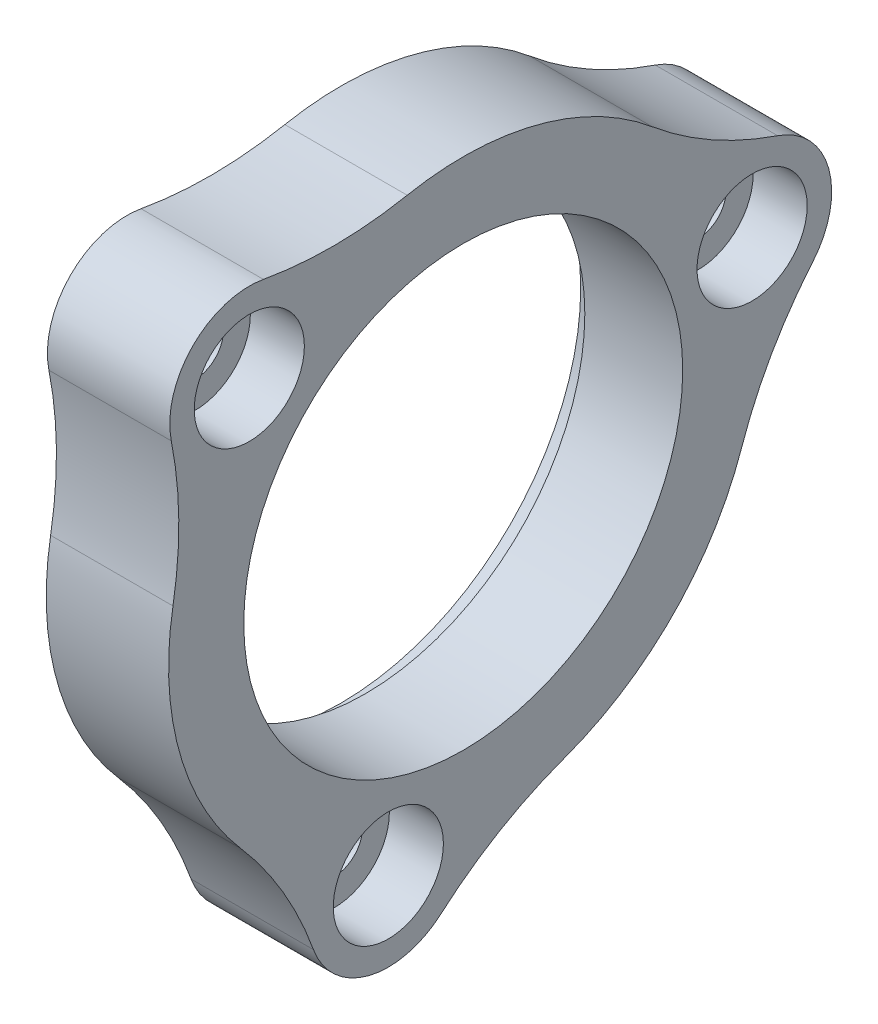
ISO-10303-21;
HEADER;
FILE_DESCRIPTION(('STEP AP214'),'2;1');
FILE_NAME('part.step','',(''),(''),'','','');
FILE_SCHEMA(('AUTOMOTIVE_DESIGN { 1 0 10303 214 1 1 1 1 }'));
ENDSEC;
DATA;
#1=APPLICATION_CONTEXT('core data for automotive mechanical design processes');
#2=APPLICATION_PROTOCOL_DEFINITION('international standard','automotive_design',2000,#1);
#3=PRODUCT_CONTEXT('',#1,'mechanical');
#4=PRODUCT('Part','Part','',(#3));
#5=PRODUCT_RELATED_PRODUCT_CATEGORY('part','',(#4));
#6=PRODUCT_DEFINITION_FORMATION('','',#4);
#7=PRODUCT_DEFINITION_CONTEXT('part definition',#1,'design');
#8=PRODUCT_DEFINITION('design','',#6,#7);
#9=PRODUCT_DEFINITION_SHAPE('','',#8);
#10=(LENGTH_UNIT() NAMED_UNIT(*) SI_UNIT(.MILLI.,.METRE.));
#11=(NAMED_UNIT(*) PLANE_ANGLE_UNIT() SI_UNIT($,.RADIAN.));
#12=(NAMED_UNIT(*) SI_UNIT($,.STERADIAN.) SOLID_ANGLE_UNIT());
#13=UNCERTAINTY_MEASURE_WITH_UNIT(LENGTH_MEASURE(1.E-05),#10,'distance_accuracy_value','');
#14=(GEOMETRIC_REPRESENTATION_CONTEXT(3) GLOBAL_UNCERTAINTY_ASSIGNED_CONTEXT((#13)) GLOBAL_UNIT_ASSIGNED_CONTEXT((#10,
#11,#12)) REPRESENTATION_CONTEXT('',''));
#15=CARTESIAN_POINT('',(0.,0.,0.));
#16=DIRECTION('',(0.,0.,1.));
#17=DIRECTION('',(1.,0.,0.));
#18=AXIS2_PLACEMENT_3D('',#15,#16,#17);
#19=CARTESIAN_POINT('',(55.5625,36.576,-137.31419272294));
#20=DIRECTION('',(-1.,0.,0.));
#21=DIRECTION('',(0.,0.,1.));
#22=AXIS2_PLACEMENT_3D('',#19,#20,#21);
#23=CYLINDRICAL_SURFACE('',#22,14.2367);
#24=CARTESIAN_POINT('',(55.5625,36.576,-137.31419272294));
#25=DIRECTION('',(1.,0.,0.));
#26=DIRECTION('',(0.,0.,-1.));
#27=AXIS2_PLACEMENT_3D('',#24,#25,#26);
#28=CIRCLE('',#27,14.2367);
#29=CARTESIAN_POINT('',(55.5625,36.576,-151.55089272294));
#30=VERTEX_POINT('',#29);
#31=EDGE_CURVE('E157',#30,#30,#28,.T.);
#32=ORIENTED_EDGE('',*,*,#31,.T.);
#33=EDGE_LOOP('',(#32));
#34=FACE_BOUND('',#33,.T.);
#35=CARTESIAN_POINT('',(49.2125,36.576,-137.31419272294));
#36=DIRECTION('',(-1.,0.,0.));
#37=DIRECTION('',(0.,0.,1.));
#38=AXIS2_PLACEMENT_3D('',#35,#36,#37);
#39=CIRCLE('',#38,14.2367);
#40=CARTESIAN_POINT('',(49.2125,36.576,-123.07749272294));
#41=VERTEX_POINT('',#40);
#42=EDGE_CURVE('E48',#41,#41,#39,.T.);
#43=ORIENTED_EDGE('',*,*,#42,.T.);
#44=EDGE_LOOP('',(#43));
#45=FACE_BOUND('',#44,.T.);
#46=ADVANCED_FACE('F44',(#34,#45),#23,.F.);
#47=CARTESIAN_POINT('',(55.5625,36.576,-137.31419272294));
#48=DIRECTION('',(-1.,0.,0.));
#49=DIRECTION('',(0.,0.,1.));
#50=AXIS2_PLACEMENT_3D('',#47,#48,#49);
#51=CYLINDRICAL_SURFACE('',#50,19.1135);
#52=CARTESIAN_POINT('',(55.5625,36.576,-137.31419272294));
#53=DIRECTION('',(1.,0.,0.));
#54=DIRECTION('',(0.,0.,-1.));
#55=AXIS2_PLACEMENT_3D('',#52,#53,#54);
#56=CIRCLE('',#55,19.1135);
#57=CARTESIAN_POINT('',(55.5625,39.8642110754653,-118.485662504859));
#58=VERTEX_POINT('',#57);
#59=CARTESIAN_POINT('',(55.5625,24.045454876961,-122.881198537066));
#60=VERTEX_POINT('',#59);
#61=EDGE_CURVE('E147',#58,#60,#56,.T.);
#62=ORIENTED_EDGE('',*,*,#61,.F.);
#63=DIRECTION('',(-1.,0.,0.));
#64=VECTOR('',#63,1.);
#65=CARTESIAN_POINT('',(55.5625,39.8642110754653,-118.485662504859));
#66=LINE('',#65,#64);
#67=CARTESIAN_POINT('',(47.625,39.8642110754653,-118.485662504859));
#68=VERTEX_POINT('',#67);
#69=EDGE_CURVE('E245',#58,#68,#66,.T.);
#70=ORIENTED_EDGE('',*,*,#69,.T.);
#71=CARTESIAN_POINT('',(47.625,36.576,-137.31419272294));
#72=DIRECTION('',(1.,0.,0.));
#73=DIRECTION('',(0.,0.,-1.));
#74=AXIS2_PLACEMENT_3D('',#71,#72,#73);
#75=CIRCLE('',#74,19.1135);
#76=CARTESIAN_POINT('',(47.625,24.045454876961,-122.881198537066));
#77=VERTEX_POINT('',#76);
#78=EDGE_CURVE('E239',#68,#77,#75,.T.);
#79=ORIENTED_EDGE('',*,*,#78,.T.);
#80=DIRECTION('',(-1.,0.,0.));
#81=VECTOR('',#80,1.);
#82=CARTESIAN_POINT('',(55.5625,24.045454876961,-122.881198537066));
#83=LINE('',#82,#81);
#84=EDGE_CURVE('E242',#77,#60,#83,.F.);
#85=ORIENTED_EDGE('',*,*,#84,.T.);
#86=EDGE_LOOP('',(#62,#70,#79,#85));
#87=FACE_BOUND('',#86,.T.);
#88=ADVANCED_FACE('F271',(#87),#51,.T.);
#89=CARTESIAN_POINT('',(47.625,18.6259089774863,-143.880783507622));
#90=VERTEX_POINT('',#89);
#91=CARTESIAN_POINT('',(47.625,30.3419329438792,-155.382460215696));
#92=VERTEX_POINT('',#91);
#93=EDGE_CURVE('E237',#90,#92,#75,.T.);
#94=ORIENTED_EDGE('',*,*,#93,.T.);
#95=DIRECTION('',(-1.,0.,0.));
#96=VECTOR('',#95,1.);
#97=CARTESIAN_POINT('',(55.5625,30.3419329438792,-155.382460215696));
#98=LINE('',#97,#96);
#99=CARTESIAN_POINT('',(55.5625,30.3419329438792,-155.382460215696));
#100=VERTEX_POINT('',#99);
#101=EDGE_CURVE('E257',#92,#100,#98,.F.);
#102=ORIENTED_EDGE('',*,*,#101,.T.);
#103=CARTESIAN_POINT('',(55.5625,18.6259089774863,-143.880783507622));
#104=VERTEX_POINT('',#103);
#105=EDGE_CURVE('E233',#104,#100,#56,.T.);
#106=ORIENTED_EDGE('',*,*,#105,.F.);
#107=DIRECTION('',(-1.,0.,0.));
#108=VECTOR('',#107,1.);
#109=CARTESIAN_POINT('',(55.5625,18.6259089774863,-143.880783507622));
#110=LINE('',#109,#108);
#111=EDGE_CURVE('E255',#104,#90,#110,.T.);
#112=ORIENTED_EDGE('',*,*,#111,.T.);
#113=EDGE_LOOP('',(#94,#102,#106,#112));
#114=FACE_BOUND('',#113,.T.);
#115=ADVANCED_FACE('F294',(#114),#51,.T.);
#116=CARTESIAN_POINT('',(55.5625,36.576,-137.31419272294));
#117=DIRECTION('',(1.,0.,0.));
#118=DIRECTION('',(0.,0.,-1.));
#119=AXIS2_PLACEMENT_3D('',#116,#117,#118);
#120=PLANE('',#119);
#121=CARTESIAN_POINT('',(55.5625,50.1999312279,-123.436363530391));
#122=DIRECTION('',(1.,0.,0.));
#123=DIRECTION('',(0.,0.,-1.));
#124=AXIS2_PLACEMENT_3D('',#121,#122,#123);
#125=CIRCLE('',#124,3.57250999999999);
#126=CARTESIAN_POINT('',(55.5625,50.1999312279,-127.008873530391));
#127=VERTEX_POINT('',#126);
#128=EDGE_CURVE('E204',#127,#127,#125,.T.);
#129=ORIENTED_EDGE('',*,*,#128,.F.);
#130=EDGE_LOOP('',(#129));
#131=FACE_BOUND('',#130,.T.);
#132=CARTESIAN_POINT('',(55.5625,17.7454817559217,-132.454436776441));
#133=DIRECTION('',(1.,0.,0.));
#134=DIRECTION('',(0.,0.,-1.));
#135=AXIS2_PLACEMENT_3D('',#132,#133,#134);
#136=CIRCLE('',#135,3.57250999999999);
#137=CARTESIAN_POINT('',(55.5625,17.7454817559217,-136.026946776441));
#138=VERTEX_POINT('',#137);
#139=EDGE_CURVE('E191',#138,#138,#136,.T.);
#140=ORIENTED_EDGE('',*,*,#139,.F.);
#141=EDGE_LOOP('',(#140));
#142=FACE_BOUND('',#141,.T.);
#143=CARTESIAN_POINT('',(55.5625,41.7825870161783,-156.051777861988));
#144=DIRECTION('',(1.,0.,0.));
#145=DIRECTION('',(0.,0.,-1.));
#146=AXIS2_PLACEMENT_3D('',#143,#144,#145);
#147=CIRCLE('',#146,3.57250999999999);
#148=CARTESIAN_POINT('',(55.5625,41.7825870161783,-159.624287861988));
#149=VERTEX_POINT('',#148);
#150=EDGE_CURVE('E187',#149,#149,#147,.T.);
#151=ORIENTED_EDGE('',*,*,#150,.F.);
#152=EDGE_LOOP('',(#151));
#153=FACE_BOUND('',#152,.T.);
#154=CARTESIAN_POINT('',(55.5625,50.1999312279,-123.436363530391));
#155=DIRECTION('',(1.,0.,0.));
#156=DIRECTION('',(0.,0.,-1.));
#157=AXIS2_PLACEMENT_3D('',#154,#155,#156);
#158=CIRCLE('',#157,5.16001);
#159=CARTESIAN_POINT('',(55.5625,55.2783929447093,-124.350108457054));
#160=VERTEX_POINT('',#159);
#161=CARTESIAN_POINT('',(55.5625,49.1925806884956,-118.375637486545));
#162=VERTEX_POINT('',#161);
#163=EDGE_CURVE('E143',#160,#162,#158,.T.);
#164=ORIENTED_EDGE('',*,*,#163,.T.);
#165=CARTESIAN_POINT('',(55.5625,44.2339267903693,-93.464359889469));
#166=DIRECTION('',(1.,0.,0.));
#167=DIRECTION('',(0.,0.,-1.));
#168=AXIS2_PLACEMENT_3D('',#165,#166,#167);
#169=CIRCLE('',#168,25.4);
#170=EDGE_CURVE('E264',#162,#58,#169,.F.);
#171=ORIENTED_EDGE('',*,*,#170,.T.);
#172=ORIENTED_EDGE('',*,*,#61,.T.);
#173=CARTESIAN_POINT('',(55.5625,7.39356767026464,-103.701139818296));
#174=DIRECTION('',(1.,0.,0.));
#175=DIRECTION('',(0.,0.,-1.));
#176=AXIS2_PLACEMENT_3D('',#173,#174,#175);
#177=CIRCLE('',#176,25.4);
#178=CARTESIAN_POINT('',(55.5625,15.9975772165864,-127.599487454206));
#179=VERTEX_POINT('',#178);
#180=EDGE_CURVE('E68',#60,#179,#177,.F.);
#181=ORIENTED_EDGE('',*,*,#180,.T.);
#182=CARTESIAN_POINT('',(55.5625,17.7454817559217,-132.454436776441));
#183=DIRECTION('',(1.,0.,0.));
#184=DIRECTION('',(0.,0.,-1.));
#185=AXIS2_PLACEMENT_3D('',#182,#183,#184);
#186=CIRCLE('',#185,5.16000999999998);
#187=CARTESIAN_POINT('',(55.5625,13.8664397100597,-135.857190956004));
#188=VERTEX_POINT('',#187);
#189=EDGE_CURVE('E183',#179,#188,#186,.T.);
#190=ORIENTED_EDGE('',*,*,#189,.T.);
#191=CARTESIAN_POINT('',(55.5625,-5.22803258067145,-152.607149998894));
#192=DIRECTION('',(1.,0.,0.));
#193=DIRECTION('',(0.,0.,-1.));
#194=AXIS2_PLACEMENT_3D('',#191,#192,#193);
#195=CIRCLE('',#194,25.4);
#196=EDGE_CURVE('E53',#188,#104,#195,.F.);
#197=ORIENTED_EDGE('',*,*,#196,.T.);
#198=ORIENTED_EDGE('',*,*,#105,.T.);
#199=CARTESIAN_POINT('',(55.5625,22.0574584506953,-179.393446917033));
#200=DIRECTION('',(1.,0.,0.));
#201=DIRECTION('',(0.,0.,-1.));
#202=AXIS2_PLACEMENT_3D('',#199,#200,#201);
#203=CIRCLE('',#202,25.4);
#204=CARTESIAN_POINT('',(55.5625,38.4520298387043,-159.99298225756));
#205=VERTEX_POINT('',#204);
#206=EDGE_CURVE('E172',#100,#205,#203,.F.);
#207=ORIENTED_EDGE('',*,*,#206,.T.);
#208=CARTESIAN_POINT('',(55.5625,41.7825870161783,-156.051777861988));
#209=DIRECTION('',(1.,0.,0.));
#210=DIRECTION('',(0.,0.,-1.));
#211=AXIS2_PLACEMENT_3D('',#208,#209,#210);
#212=CIRCLE('',#211,5.16000999999998);
#213=CARTESIAN_POINT('',(55.5625,46.6689796014447,-157.709749726271));
#214=VERTEX_POINT('',#213);
#215=EDGE_CURVE('E223',#205,#214,#212,.T.);
#216=ORIENTED_EDGE('',*,*,#215,.T.);
#217=CARTESIAN_POINT('',(55.5625,70.7221057903021,-165.871068280457));
#218=DIRECTION('',(1.,0.,0.));
#219=DIRECTION('',(0.,0.,-1.));
#220=AXIS2_PLACEMENT_3D('',#217,#218,#219);
#221=CIRCLE('',#220,25.4);
#222=CARTESIAN_POINT('',(55.5625,51.2378799470484,-149.576132156339));
#223=VERTEX_POINT('',#222);
#224=EDGE_CURVE('E163',#214,#223,#221,.F.);
#225=ORIENTED_EDGE('',*,*,#224,.T.);
#226=CARTESIAN_POINT('',(55.5625,55.3406121791598,-133.678919416058));
#227=VERTEX_POINT('',#226);
#228=EDGE_CURVE('E236',#223,#227,#56,.T.);
#229=ORIENTED_EDGE('',*,*,#228,.T.);
#230=CARTESIAN_POINT('',(55.5625,80.27697387904,-128.847991433491));
#231=DIRECTION('',(1.,0.,0.));
#232=DIRECTION('',(0.,0.,-1.));
#233=AXIS2_PLACEMENT_3D('',#230,#231,#232);
#234=CIRCLE('',#233,25.4);
#235=EDGE_CURVE('E164',#227,#160,#234,.F.);
#236=ORIENTED_EDGE('',*,*,#235,.T.);
#237=EDGE_LOOP('',(#164,#171,#172,#181,#190,#197,#198,#207,#216,#225,#229,#236));
#238=FACE_BOUND('',#237,.T.);
#239=ORIENTED_EDGE('',*,*,#31,.F.);
#240=EDGE_LOOP('',(#239));
#241=FACE_BOUND('',#240,.T.);
#242=ADVANCED_FACE('F266',(#131,#142,#153,#238,#241),#120,.T.);
#243=CARTESIAN_POINT('',(47.625,36.576,-137.31419272294));
#244=DIRECTION('',(1.,0.,0.));
#245=DIRECTION('',(0.,0.,-1.));
#246=AXIS2_PLACEMENT_3D('',#243,#244,#245);
#247=PLANE('',#246);
#248=CARTESIAN_POINT('',(47.625,36.576,-137.31419272294));
#249=DIRECTION('',(-1.,0.,0.));
#250=DIRECTION('',(0.,0.,1.));
#251=AXIS2_PLACEMENT_3D('',#248,#249,#250);
#252=CIRCLE('',#251,15.5575);
#253=CARTESIAN_POINT('',(47.625,36.576,-121.75669272294));
#254=VERTEX_POINT('',#253);
#255=EDGE_CURVE('E608',#254,#254,#252,.T.);
#256=ORIENTED_EDGE('',*,*,#255,.F.);
#257=EDGE_LOOP('',(#256));
#258=FACE_BOUND('',#257,.T.);
#259=CARTESIAN_POINT('',(47.625,50.1999312279,-123.436363530391));
#260=DIRECTION('',(1.,0.,0.));
#261=DIRECTION('',(0.,0.,-1.));
#262=AXIS2_PLACEMENT_3D('',#259,#260,#261);
#263=CIRCLE('',#262,1.8288);
#264=CARTESIAN_POINT('',(47.625,50.1999312279,-125.265163530391));
#265=VERTEX_POINT('',#264);
#266=EDGE_CURVE('E189',#265,#265,#263,.T.);
#267=ORIENTED_EDGE('',*,*,#266,.T.);
#268=EDGE_LOOP('',(#267));
#269=FACE_BOUND('',#268,.T.);
#270=CARTESIAN_POINT('',(47.625,17.7454817559217,-132.454436776441));
#271=DIRECTION('',(1.,0.,0.));
#272=DIRECTION('',(0.,0.,-1.));
#273=AXIS2_PLACEMENT_3D('',#270,#271,#272);
#274=CIRCLE('',#273,1.8288);
#275=CARTESIAN_POINT('',(47.625,17.7454817559217,-134.283236776441));
#276=VERTEX_POINT('',#275);
#277=EDGE_CURVE('E185',#276,#276,#274,.T.);
#278=ORIENTED_EDGE('',*,*,#277,.T.);
#279=EDGE_LOOP('',(#278));
#280=FACE_BOUND('',#279,.T.);
#281=CARTESIAN_POINT('',(47.625,41.7825870161783,-156.051777861988));
#282=DIRECTION('',(1.,0.,0.));
#283=DIRECTION('',(0.,0.,-1.));
#284=AXIS2_PLACEMENT_3D('',#281,#282,#283);
#285=CIRCLE('',#284,1.8288);
#286=CARTESIAN_POINT('',(47.625,41.7825870161783,-157.880577861988));
#287=VERTEX_POINT('',#286);
#288=EDGE_CURVE('E180',#287,#287,#285,.T.);
#289=ORIENTED_EDGE('',*,*,#288,.T.);
#290=EDGE_LOOP('',(#289));
#291=FACE_BOUND('',#290,.T.);
#292=ORIENTED_EDGE('',*,*,#78,.F.);
#293=CARTESIAN_POINT('',(47.625,44.2339267903693,-93.464359889469));
#294=DIRECTION('',(1.,0.,0.));
#295=DIRECTION('',(0.,0.,-1.));
#296=AXIS2_PLACEMENT_3D('',#293,#294,#295);
#297=CIRCLE('',#296,25.4);
#298=CARTESIAN_POINT('',(47.625,49.1925806884956,-118.375637486545));
#299=VERTEX_POINT('',#298);
#300=EDGE_CURVE('E156',#68,#299,#297,.T.);
#301=ORIENTED_EDGE('',*,*,#300,.T.);
#302=CARTESIAN_POINT('',(47.625,50.1999312279,-123.436363530391));
#303=DIRECTION('',(-1.,0.,0.));
#304=DIRECTION('',(0.,0.,1.));
#305=AXIS2_PLACEMENT_3D('',#302,#303,#304);
#306=CIRCLE('',#305,5.16001);
#307=CARTESIAN_POINT('',(47.625,55.2783929447093,-124.350108457054));
#308=VERTEX_POINT('',#307);
#309=EDGE_CURVE('E140',#308,#299,#306,.F.);
#310=ORIENTED_EDGE('',*,*,#309,.F.);
#311=CARTESIAN_POINT('',(47.625,80.27697387904,-128.847991433491));
#312=DIRECTION('',(1.,0.,0.));
#313=DIRECTION('',(0.,0.,-1.));
#314=AXIS2_PLACEMENT_3D('',#311,#312,#313);
#315=CIRCLE('',#314,25.4);
#316=CARTESIAN_POINT('',(47.625,55.3406121791598,-133.678919416058));
#317=VERTEX_POINT('',#316);
#318=EDGE_CURVE('E153',#308,#317,#315,.T.);
#319=ORIENTED_EDGE('',*,*,#318,.T.);
#320=CARTESIAN_POINT('',(47.625,51.2378799470484,-149.576132156339));
#321=VERTEX_POINT('',#320);
#322=EDGE_CURVE('E232',#321,#317,#75,.T.);
#323=ORIENTED_EDGE('',*,*,#322,.F.);
#324=CARTESIAN_POINT('',(47.625,70.7221057903021,-165.871068280457));
#325=DIRECTION('',(1.,0.,0.));
#326=DIRECTION('',(0.,0.,-1.));
#327=AXIS2_PLACEMENT_3D('',#324,#325,#326);
#328=CIRCLE('',#327,25.4);
#329=CARTESIAN_POINT('',(47.625,46.6689796014447,-157.709749726271));
#330=VERTEX_POINT('',#329);
#331=EDGE_CURVE('E166',#321,#330,#328,.T.);
#332=ORIENTED_EDGE('',*,*,#331,.T.);
#333=CARTESIAN_POINT('',(47.625,41.7825870161783,-156.051777861988));
#334=DIRECTION('',(-1.,0.,0.));
#335=DIRECTION('',(0.,0.,1.));
#336=AXIS2_PLACEMENT_3D('',#333,#334,#335);
#337=CIRCLE('',#336,5.16000999999998);
#338=CARTESIAN_POINT('',(47.625,38.4520298387043,-159.99298225756));
#339=VERTEX_POINT('',#338);
#340=EDGE_CURVE('E226',#339,#330,#337,.F.);
#341=ORIENTED_EDGE('',*,*,#340,.F.);
#342=CARTESIAN_POINT('',(47.625,22.0574584506953,-179.393446917033));
#343=DIRECTION('',(1.,0.,0.));
#344=DIRECTION('',(0.,0.,-1.));
#345=AXIS2_PLACEMENT_3D('',#342,#343,#344);
#346=CIRCLE('',#345,25.4);
#347=EDGE_CURVE('E174',#339,#92,#346,.T.);
#348=ORIENTED_EDGE('',*,*,#347,.T.);
#349=ORIENTED_EDGE('',*,*,#93,.F.);
#350=CARTESIAN_POINT('',(47.625,-5.22803258067145,-152.607149998894));
#351=DIRECTION('',(1.,0.,0.));
#352=DIRECTION('',(0.,0.,-1.));
#353=AXIS2_PLACEMENT_3D('',#350,#351,#352);
#354=CIRCLE('',#353,25.4);
#355=CARTESIAN_POINT('',(47.625,13.8664397100597,-135.857190956004));
#356=VERTEX_POINT('',#355);
#357=EDGE_CURVE('E11',#90,#356,#354,.T.);
#358=ORIENTED_EDGE('',*,*,#357,.T.);
#359=CARTESIAN_POINT('',(47.625,17.7454817559217,-132.454436776441));
#360=DIRECTION('',(-1.,0.,0.));
#361=DIRECTION('',(0.,0.,1.));
#362=AXIS2_PLACEMENT_3D('',#359,#360,#361);
#363=CIRCLE('',#362,5.16000999999998);
#364=CARTESIAN_POINT('',(47.625,15.9975772165864,-127.599487454206));
#365=VERTEX_POINT('',#364);
#366=EDGE_CURVE('E220',#365,#356,#363,.F.);
#367=ORIENTED_EDGE('',*,*,#366,.F.);
#368=CARTESIAN_POINT('',(47.625,7.39356767026464,-103.701139818296));
#369=DIRECTION('',(1.,0.,0.));
#370=DIRECTION('',(0.,0.,-1.));
#371=AXIS2_PLACEMENT_3D('',#368,#369,#370);
#372=CIRCLE('',#371,25.4);
#373=EDGE_CURVE('E177',#365,#77,#372,.T.);
#374=ORIENTED_EDGE('',*,*,#373,.T.);
#375=EDGE_LOOP('',(#292,#301,#310,#319,#323,#332,#341,#348,#349,#358,#367,#374));
#376=FACE_BOUND('',#375,.T.);
#377=ADVANCED_FACE('F151',(#258,#269,#280,#291,#376),#247,.F.);
#378=ORIENTED_EDGE('',*,*,#322,.T.);
#379=DIRECTION('',(-1.,0.,0.));
#380=VECTOR('',#379,1.);
#381=CARTESIAN_POINT('',(55.5625,55.3406121791598,-133.678919416058));
#382=LINE('',#381,#380);
#383=EDGE_CURVE('E162',#317,#227,#382,.F.);
#384=ORIENTED_EDGE('',*,*,#383,.T.);
#385=ORIENTED_EDGE('',*,*,#228,.F.);
#386=DIRECTION('',(-1.,0.,0.));
#387=VECTOR('',#386,1.);
#388=CARTESIAN_POINT('',(55.5625,51.2378799470484,-149.576132156339));
#389=LINE('',#388,#387);
#390=EDGE_CURVE('E247',#223,#321,#389,.T.);
#391=ORIENTED_EDGE('',*,*,#390,.T.);
#392=EDGE_LOOP('',(#378,#384,#385,#391));
#393=FACE_BOUND('',#392,.T.);
#394=ADVANCED_FACE('F295',(#393),#51,.T.);
#395=CARTESIAN_POINT('',(34.2530979665016,50.1999312279,-123.436363530391));
#396=DIRECTION('',(1.,0.,0.));
#397=DIRECTION('',(0.,0.,-1.));
#398=AXIS2_PLACEMENT_3D('',#395,#396,#397);
#399=CYLINDRICAL_SURFACE('',#398,5.16001);
#400=ORIENTED_EDGE('',*,*,#309,.T.);
#401=DIRECTION('',(1.,0.,0.));
#402=VECTOR('',#401,1.);
#403=CARTESIAN_POINT('',(34.2530979665016,49.1925806884956,-118.375637486545));
#404=LINE('',#403,#402);
#405=EDGE_CURVE('E146',#299,#162,#404,.T.);
#406=ORIENTED_EDGE('',*,*,#405,.T.);
#407=ORIENTED_EDGE('',*,*,#163,.F.);
#408=DIRECTION('',(1.,0.,0.));
#409=VECTOR('',#408,1.);
#410=CARTESIAN_POINT('',(34.2530979665016,55.2783929447093,-124.350108457054));
#411=LINE('',#410,#409);
#412=EDGE_CURVE('E136',#160,#308,#411,.F.);
#413=ORIENTED_EDGE('',*,*,#412,.T.);
#414=EDGE_LOOP('',(#400,#406,#407,#413));
#415=FACE_BOUND('',#414,.T.);
#416=ADVANCED_FACE('F138',(#415),#399,.T.);
#417=CARTESIAN_POINT('',(34.2530979665016,41.7825870161783,-156.051777861988));
#418=DIRECTION('',(1.,0.,0.));
#419=DIRECTION('',(0.,0.,-1.));
#420=AXIS2_PLACEMENT_3D('',#417,#418,#419);
#421=CYLINDRICAL_SURFACE('',#420,5.16000999999998);
#422=ORIENTED_EDGE('',*,*,#340,.T.);
#423=DIRECTION('',(1.,0.,0.));
#424=VECTOR('',#423,1.);
#425=CARTESIAN_POINT('',(34.2530979665016,46.6689796014447,-157.709749726271));
#426=LINE('',#425,#424);
#427=EDGE_CURVE('E252',#330,#214,#426,.T.);
#428=ORIENTED_EDGE('',*,*,#427,.T.);
#429=ORIENTED_EDGE('',*,*,#215,.F.);
#430=DIRECTION('',(1.,0.,0.));
#431=VECTOR('',#430,1.);
#432=CARTESIAN_POINT('',(34.2530979665016,38.4520298387043,-159.99298225756));
#433=LINE('',#432,#431);
#434=EDGE_CURVE('E250',#205,#339,#433,.F.);
#435=ORIENTED_EDGE('',*,*,#434,.T.);
#436=EDGE_LOOP('',(#422,#428,#429,#435));
#437=FACE_BOUND('',#436,.T.);
#438=ADVANCED_FACE('F284',(#437),#421,.T.);
#439=CARTESIAN_POINT('',(34.2530979665016,17.7454817559217,-132.454436776441));
#440=DIRECTION('',(1.,0.,0.));
#441=DIRECTION('',(0.,0.,-1.));
#442=AXIS2_PLACEMENT_3D('',#439,#440,#441);
#443=CYLINDRICAL_SURFACE('',#442,5.16000999999998);
#444=ORIENTED_EDGE('',*,*,#189,.F.);
#445=DIRECTION('',(1.,0.,0.));
#446=VECTOR('',#445,1.);
#447=CARTESIAN_POINT('',(34.2530979665016,15.9975772165864,-127.599487454206));
#448=LINE('',#447,#446);
#449=EDGE_CURVE('E262',#179,#365,#448,.F.);
#450=ORIENTED_EDGE('',*,*,#449,.T.);
#451=ORIENTED_EDGE('',*,*,#366,.T.);
#452=DIRECTION('',(1.,0.,0.));
#453=VECTOR('',#452,1.);
#454=CARTESIAN_POINT('',(34.2530979665016,13.8664397100597,-135.857190956004));
#455=LINE('',#454,#453);
#456=EDGE_CURVE('E260',#356,#188,#455,.T.);
#457=ORIENTED_EDGE('',*,*,#456,.T.);
#458=EDGE_LOOP('',(#444,#450,#451,#457));
#459=FACE_BOUND('',#458,.T.);
#460=ADVANCED_FACE('F276',(#459),#443,.T.);
#461=CARTESIAN_POINT('',(55.5625,44.2339267903693,-93.464359889469));
#462=DIRECTION('',(-1.,0.,0.));
#463=DIRECTION('',(0.,0.,1.));
#464=AXIS2_PLACEMENT_3D('',#461,#462,#463);
#465=CYLINDRICAL_SURFACE('',#464,25.4);
#466=ORIENTED_EDGE('',*,*,#300,.F.);
#467=ORIENTED_EDGE('',*,*,#69,.F.);
#468=ORIENTED_EDGE('',*,*,#170,.F.);
#469=ORIENTED_EDGE('',*,*,#405,.F.);
#470=EDGE_LOOP('',(#466,#467,#468,#469));
#471=FACE_BOUND('',#470,.T.);
#472=ADVANCED_FACE('F274',(#471),#465,.F.);
#473=CARTESIAN_POINT('',(34.2530979665016,80.27697387904,-128.847991433491));
#474=DIRECTION('',(-1.,0.,0.));
#475=DIRECTION('',(0.,0.,1.));
#476=AXIS2_PLACEMENT_3D('',#473,#474,#475);
#477=CYLINDRICAL_SURFACE('',#476,25.4);
#478=ORIENTED_EDGE('',*,*,#318,.F.);
#479=ORIENTED_EDGE('',*,*,#412,.F.);
#480=ORIENTED_EDGE('',*,*,#235,.F.);
#481=ORIENTED_EDGE('',*,*,#383,.F.);
#482=EDGE_LOOP('',(#478,#479,#480,#481));
#483=FACE_BOUND('',#482,.T.);
#484=ADVANCED_FACE('F160',(#483),#477,.F.);
#485=CARTESIAN_POINT('',(55.5625,70.7221057903021,-165.871068280457));
#486=DIRECTION('',(-1.,0.,0.));
#487=DIRECTION('',(0.,0.,1.));
#488=AXIS2_PLACEMENT_3D('',#485,#486,#487);
#489=CYLINDRICAL_SURFACE('',#488,25.4);
#490=ORIENTED_EDGE('',*,*,#331,.F.);
#491=ORIENTED_EDGE('',*,*,#390,.F.);
#492=ORIENTED_EDGE('',*,*,#224,.F.);
#493=ORIENTED_EDGE('',*,*,#427,.F.);
#494=EDGE_LOOP('',(#490,#491,#492,#493));
#495=FACE_BOUND('',#494,.T.);
#496=ADVANCED_FACE('F282',(#495),#489,.F.);
#497=CARTESIAN_POINT('',(34.2530979665016,22.0574584506953,-179.393446917033));
#498=DIRECTION('',(-1.,0.,0.));
#499=DIRECTION('',(0.,0.,1.));
#500=AXIS2_PLACEMENT_3D('',#497,#498,#499);
#501=CYLINDRICAL_SURFACE('',#500,25.4);
#502=ORIENTED_EDGE('',*,*,#347,.F.);
#503=ORIENTED_EDGE('',*,*,#434,.F.);
#504=ORIENTED_EDGE('',*,*,#206,.F.);
#505=ORIENTED_EDGE('',*,*,#101,.F.);
#506=EDGE_LOOP('',(#502,#503,#504,#505));
#507=FACE_BOUND('',#506,.T.);
#508=ADVANCED_FACE('F320',(#507),#501,.F.);
#509=CARTESIAN_POINT('',(34.2530979665016,7.39356767026464,-103.701139818296));
#510=DIRECTION('',(-1.,0.,0.));
#511=DIRECTION('',(0.,0.,1.));
#512=AXIS2_PLACEMENT_3D('',#509,#510,#511);
#513=CYLINDRICAL_SURFACE('',#512,25.4);
#514=ORIENTED_EDGE('',*,*,#373,.F.);
#515=ORIENTED_EDGE('',*,*,#449,.F.);
#516=ORIENTED_EDGE('',*,*,#180,.F.);
#517=ORIENTED_EDGE('',*,*,#84,.F.);
#518=EDGE_LOOP('',(#514,#515,#516,#517));
#519=FACE_BOUND('',#518,.T.);
#520=ADVANCED_FACE('F333',(#519),#513,.F.);
#521=CARTESIAN_POINT('',(55.5625,-5.22803258067145,-152.607149998894));
#522=DIRECTION('',(-1.,0.,0.));
#523=DIRECTION('',(0.,0.,1.));
#524=AXIS2_PLACEMENT_3D('',#521,#522,#523);
#525=CYLINDRICAL_SURFACE('',#524,25.4);
#526=ORIENTED_EDGE('',*,*,#357,.F.);
#527=ORIENTED_EDGE('',*,*,#111,.F.);
#528=ORIENTED_EDGE('',*,*,#196,.F.);
#529=ORIENTED_EDGE('',*,*,#456,.F.);
#530=EDGE_LOOP('',(#526,#527,#528,#529));
#531=FACE_BOUND('',#530,.T.);
#532=ADVANCED_FACE('F46',(#531),#525,.F.);
#533=CARTESIAN_POINT('',(55.5625,41.7825870161783,-156.051777861988));
#534=DIRECTION('',(1.,0.,0.));
#535=DIRECTION('',(0.,0.,-1.));
#536=AXIS2_PLACEMENT_3D('',#533,#534,#535);
#537=CYLINDRICAL_SURFACE('',#536,1.8288);
#538=CARTESIAN_POINT('',(52.0573,41.7825870161783,-156.051777861988));
#539=DIRECTION('',(1.,0.,0.));
#540=DIRECTION('',(0.,0.,-1.));
#541=AXIS2_PLACEMENT_3D('',#538,#539,#540);
#542=CIRCLE('',#541,1.8288);
#543=CARTESIAN_POINT('',(52.0573,41.7825870161783,-157.880577861988));
#544=VERTEX_POINT('',#543);
#545=EDGE_CURVE('E184',#544,#544,#542,.T.);
#546=ORIENTED_EDGE('',*,*,#545,.T.);
#547=EDGE_LOOP('',(#546));
#548=FACE_BOUND('',#547,.T.);
#549=ORIENTED_EDGE('',*,*,#288,.F.);
#550=EDGE_LOOP('',(#549));
#551=FACE_BOUND('',#550,.T.);
#552=ADVANCED_FACE('F337',(#548,#551),#537,.F.);
#553=CARTESIAN_POINT('',(52.0573,43.6113870161783,-156.051777861988));
#554=DIRECTION('',(-1.,0.,0.));
#555=DIRECTION('',(0.,0.,1.));
#556=AXIS2_PLACEMENT_3D('',#553,#554,#555);
#557=PLANE('',#556);
#558=ORIENTED_EDGE('',*,*,#545,.F.);
#559=EDGE_LOOP('',(#558));
#560=FACE_BOUND('',#559,.T.);
#561=CARTESIAN_POINT('',(52.0573,41.7825870161783,-156.051777861988));
#562=DIRECTION('',(1.,0.,0.));
#563=DIRECTION('',(0.,0.,-1.));
#564=AXIS2_PLACEMENT_3D('',#561,#562,#563);
#565=CIRCLE('',#564,3.57250999999999);
#566=CARTESIAN_POINT('',(52.0573,41.7825870161783,-159.624287861988));
#567=VERTEX_POINT('',#566);
#568=EDGE_CURVE('E214',#567,#567,#565,.T.);
#569=ORIENTED_EDGE('',*,*,#568,.T.);
#570=EDGE_LOOP('',(#569));
#571=FACE_BOUND('',#570,.T.);
#572=ADVANCED_FACE('F342',(#560,#571),#557,.F.);
#573=CARTESIAN_POINT('',(55.5625,41.7825870161783,-156.051777861988));
#574=DIRECTION('',(1.,0.,0.));
#575=DIRECTION('',(0.,0.,-1.));
#576=AXIS2_PLACEMENT_3D('',#573,#574,#575);
#577=CYLINDRICAL_SURFACE('',#576,3.57250999999999);
#578=ORIENTED_EDGE('',*,*,#568,.F.);
#579=EDGE_LOOP('',(#578));
#580=FACE_BOUND('',#579,.T.);
#581=ORIENTED_EDGE('',*,*,#150,.T.);
#582=EDGE_LOOP('',(#581));
#583=FACE_BOUND('',#582,.T.);
#584=ADVANCED_FACE('F394',(#580,#583),#577,.F.);
#585=CARTESIAN_POINT('',(55.5625,17.7454817559217,-132.454436776441));
#586=DIRECTION('',(1.,0.,0.));
#587=DIRECTION('',(0.,0.,-1.));
#588=AXIS2_PLACEMENT_3D('',#585,#586,#587);
#589=CYLINDRICAL_SURFACE('',#588,1.8288);
#590=CARTESIAN_POINT('',(52.0573,17.7454817559217,-132.454436776441));
#591=DIRECTION('',(1.,0.,0.));
#592=DIRECTION('',(0.,0.,-1.));
#593=AXIS2_PLACEMENT_3D('',#590,#591,#592);
#594=CIRCLE('',#593,1.8288);
#595=CARTESIAN_POINT('',(52.0573,17.7454817559217,-134.283236776441));
#596=VERTEX_POINT('',#595);
#597=EDGE_CURVE('E188',#596,#596,#594,.T.);
#598=ORIENTED_EDGE('',*,*,#597,.T.);
#599=EDGE_LOOP('',(#598));
#600=FACE_BOUND('',#599,.T.);
#601=ORIENTED_EDGE('',*,*,#277,.F.);
#602=EDGE_LOOP('',(#601));
#603=FACE_BOUND('',#602,.T.);
#604=ADVANCED_FACE('F405',(#600,#603),#589,.F.);
#605=CARTESIAN_POINT('',(52.0573,19.5742817559217,-132.454436776441));
#606=DIRECTION('',(-1.,0.,0.));
#607=DIRECTION('',(0.,0.,1.));
#608=AXIS2_PLACEMENT_3D('',#605,#606,#607);
#609=PLANE('',#608);
#610=ORIENTED_EDGE('',*,*,#597,.F.);
#611=EDGE_LOOP('',(#610));
#612=FACE_BOUND('',#611,.T.);
#613=CARTESIAN_POINT('',(52.0573,17.7454817559217,-132.454436776441));
#614=DIRECTION('',(1.,0.,0.));
#615=DIRECTION('',(0.,0.,-1.));
#616=AXIS2_PLACEMENT_3D('',#613,#614,#615);
#617=CIRCLE('',#616,3.57250999999999);
#618=CARTESIAN_POINT('',(52.0573,17.7454817559217,-136.026946776441));
#619=VERTEX_POINT('',#618);
#620=EDGE_CURVE('E196',#619,#619,#617,.T.);
#621=ORIENTED_EDGE('',*,*,#620,.T.);
#622=EDGE_LOOP('',(#621));
#623=FACE_BOUND('',#622,.T.);
#624=ADVANCED_FACE('F416',(#612,#623),#609,.F.);
#625=CARTESIAN_POINT('',(55.5625,17.7454817559217,-132.454436776441));
#626=DIRECTION('',(1.,0.,0.));
#627=DIRECTION('',(0.,0.,-1.));
#628=AXIS2_PLACEMENT_3D('',#625,#626,#627);
#629=CYLINDRICAL_SURFACE('',#628,3.57250999999999);
#630=ORIENTED_EDGE('',*,*,#620,.F.);
#631=EDGE_LOOP('',(#630));
#632=FACE_BOUND('',#631,.T.);
#633=ORIENTED_EDGE('',*,*,#139,.T.);
#634=EDGE_LOOP('',(#633));
#635=FACE_BOUND('',#634,.T.);
#636=ADVANCED_FACE('F427',(#632,#635),#629,.F.);
#637=CARTESIAN_POINT('',(55.5625,50.1999312279,-123.436363530391));
#638=DIRECTION('',(1.,0.,0.));
#639=DIRECTION('',(0.,0.,-1.));
#640=AXIS2_PLACEMENT_3D('',#637,#638,#639);
#641=CYLINDRICAL_SURFACE('',#640,1.8288);
#642=CARTESIAN_POINT('',(52.0573,50.1999312279,-123.436363530391));
#643=DIRECTION('',(1.,0.,0.));
#644=DIRECTION('',(0.,0.,-1.));
#645=AXIS2_PLACEMENT_3D('',#642,#643,#644);
#646=CIRCLE('',#645,1.8288);
#647=CARTESIAN_POINT('',(52.0573,50.1999312279,-125.265163530391));
#648=VERTEX_POINT('',#647);
#649=EDGE_CURVE('E192',#648,#648,#646,.T.);
#650=ORIENTED_EDGE('',*,*,#649,.T.);
#651=EDGE_LOOP('',(#650));
#652=FACE_BOUND('',#651,.T.);
#653=ORIENTED_EDGE('',*,*,#266,.F.);
#654=EDGE_LOOP('',(#653));
#655=FACE_BOUND('',#654,.T.);
#656=ADVANCED_FACE('F438',(#652,#655),#641,.F.);
#657=CARTESIAN_POINT('',(52.0573,52.0287312279,-123.436363530391));
#658=DIRECTION('',(-1.,0.,0.));
#659=DIRECTION('',(0.,0.,1.));
#660=AXIS2_PLACEMENT_3D('',#657,#658,#659);
#661=PLANE('',#660);
#662=ORIENTED_EDGE('',*,*,#649,.F.);
#663=EDGE_LOOP('',(#662));
#664=FACE_BOUND('',#663,.T.);
#665=CARTESIAN_POINT('',(52.0573,50.1999312279,-123.436363530391));
#666=DIRECTION('',(1.,0.,0.));
#667=DIRECTION('',(0.,0.,-1.));
#668=AXIS2_PLACEMENT_3D('',#665,#666,#667);
#669=CIRCLE('',#668,3.57250999999999);
#670=CARTESIAN_POINT('',(52.0573,50.1999312279,-127.008873530391));
#671=VERTEX_POINT('',#670);
#672=EDGE_CURVE('E199',#671,#671,#669,.T.);
#673=ORIENTED_EDGE('',*,*,#672,.T.);
#674=EDGE_LOOP('',(#673));
#675=FACE_BOUND('',#674,.T.);
#676=ADVANCED_FACE('F449',(#664,#675),#661,.F.);
#677=CARTESIAN_POINT('',(55.5625,50.1999312279,-123.436363530391));
#678=DIRECTION('',(1.,0.,0.));
#679=DIRECTION('',(0.,0.,-1.));
#680=AXIS2_PLACEMENT_3D('',#677,#678,#679);
#681=CYLINDRICAL_SURFACE('',#680,3.57250999999999);
#682=ORIENTED_EDGE('',*,*,#672,.F.);
#683=EDGE_LOOP('',(#682));
#684=FACE_BOUND('',#683,.T.);
#685=ORIENTED_EDGE('',*,*,#128,.T.);
#686=EDGE_LOOP('',(#685));
#687=FACE_BOUND('',#686,.T.);
#688=ADVANCED_FACE('F459',(#684,#687),#681,.F.);
#689=CARTESIAN_POINT('',(49.2125,36.576,-137.31419272294));
#690=DIRECTION('',(-1.,0.,0.));
#691=DIRECTION('',(0.,0.,1.));
#692=AXIS2_PLACEMENT_3D('',#689,#690,#691);
#693=CYLINDRICAL_SURFACE('',#692,15.5575);
#694=CARTESIAN_POINT('',(49.2125,36.576,-137.31419272294));
#695=DIRECTION('',(-1.,0.,0.));
#696=DIRECTION('',(0.,0.,1.));
#697=AXIS2_PLACEMENT_3D('',#694,#695,#696);
#698=CIRCLE('',#697,15.5575);
#699=CARTESIAN_POINT('',(49.2125,36.576,-121.75669272294));
#700=VERTEX_POINT('',#699);
#701=EDGE_CURVE('E607',#700,#700,#698,.T.);
#702=ORIENTED_EDGE('',*,*,#701,.F.);
#703=EDGE_LOOP('',(#702));
#704=FACE_BOUND('',#703,.T.);
#705=ORIENTED_EDGE('',*,*,#255,.T.);
#706=EDGE_LOOP('',(#705));
#707=FACE_BOUND('',#706,.T.);
#708=ADVANCED_FACE('F469',(#704,#707),#693,.F.);
#709=CARTESIAN_POINT('',(49.2125,36.576,-137.31419272294));
#710=DIRECTION('',(-1.,0.,0.));
#711=DIRECTION('',(0.,0.,1.));
#712=AXIS2_PLACEMENT_3D('',#709,#710,#711);
#713=PLANE('',#712);
#714=ORIENTED_EDGE('',*,*,#42,.F.);
#715=EDGE_LOOP('',(#714));
#716=FACE_BOUND('',#715,.T.);
#717=ORIENTED_EDGE('',*,*,#701,.T.);
#718=EDGE_LOOP('',(#717));
#719=FACE_BOUND('',#718,.T.);
#720=ADVANCED_FACE('F494',(#716,#719),#713,.T.);
#721=CLOSED_SHELL('',(#46,#88,#115,#242,#377,#394,#416,#438,#460,#472,#484,#496,#508,#520,#532,
#552,#572,#584,#604,#624,#636,#656,#676,#688,#708,#720));
#722=MANIFOLD_SOLID_BREP('B2',#721);
#723=ADVANCED_BREP_SHAPE_REPRESENTATION('',(#18,#722),#14);
#724=SHAPE_DEFINITION_REPRESENTATION(#9,#723);
ENDSEC;
END-ISO-10303-21;
